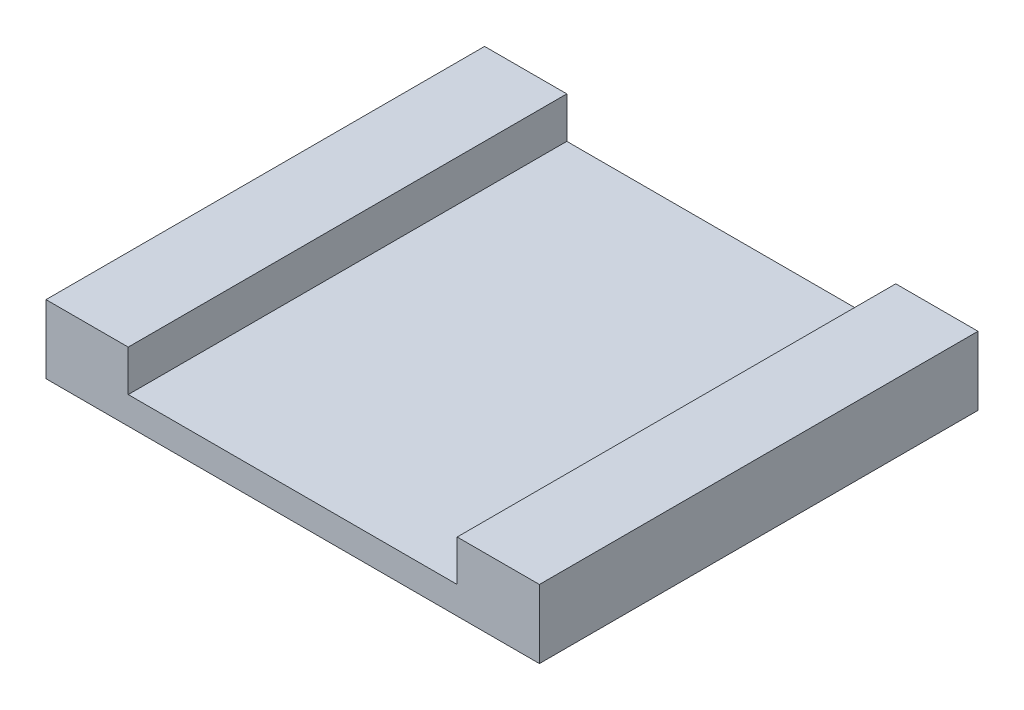
ISO-10303-21;
HEADER;
FILE_DESCRIPTION(('STEP AP214'),'2;1');
FILE_NAME('part.step','',(''),(''),'','','');
FILE_SCHEMA(('AUTOMOTIVE_DESIGN { 1 0 10303 214 1 1 1 1 }'));
ENDSEC;
DATA;
#1=APPLICATION_CONTEXT('core data for automotive mechanical design processes');
#2=APPLICATION_PROTOCOL_DEFINITION('international standard','automotive_design',2000,#1);
#3=PRODUCT_CONTEXT('',#1,'mechanical');
#4=PRODUCT('Part','Part','',(#3));
#5=PRODUCT_RELATED_PRODUCT_CATEGORY('part','',(#4));
#6=PRODUCT_DEFINITION_FORMATION('','',#4);
#7=PRODUCT_DEFINITION_CONTEXT('part definition',#1,'design');
#8=PRODUCT_DEFINITION('design','',#6,#7);
#9=PRODUCT_DEFINITION_SHAPE('','',#8);
#10=(LENGTH_UNIT() NAMED_UNIT(*) SI_UNIT(.MILLI.,.METRE.));
#11=(NAMED_UNIT(*) PLANE_ANGLE_UNIT() SI_UNIT($,.RADIAN.));
#12=(NAMED_UNIT(*) SI_UNIT($,.STERADIAN.) SOLID_ANGLE_UNIT());
#13=UNCERTAINTY_MEASURE_WITH_UNIT(LENGTH_MEASURE(1.E-05),#10,'distance_accuracy_value','');
#14=(GEOMETRIC_REPRESENTATION_CONTEXT(3) GLOBAL_UNCERTAINTY_ASSIGNED_CONTEXT((#13)) GLOBAL_UNIT_ASSIGNED_CONTEXT((#10,
#11,#12)) REPRESENTATION_CONTEXT('',''));
#15=CARTESIAN_POINT('',(0.,0.,0.));
#16=DIRECTION('',(0.,0.,1.));
#17=DIRECTION('',(1.,0.,0.));
#18=AXIS2_PLACEMENT_3D('',#15,#16,#17);
#19=CARTESIAN_POINT('',(0.,0.,-203.2));
#20=DIRECTION('',(0.,1.,0.));
#21=DIRECTION('',(0.,0.,1.));
#22=AXIS2_PLACEMENT_3D('',#19,#20,#21);
#23=PLANE('',#22);
#24=DIRECTION('',(-1.,0.,0.));
#25=VECTOR('',#24,1.);
#26=CARTESIAN_POINT('',(0.,0.,0.));
#27=LINE('',#26,#25);
#28=CARTESIAN_POINT('',(76.2,0.,0.));
#29=VERTEX_POINT('',#28);
#30=CARTESIAN_POINT('',(-76.2,0.,0.));
#31=VERTEX_POINT('',#30);
#32=EDGE_CURVE('E137',#29,#31,#27,.T.);
#33=ORIENTED_EDGE('',*,*,#32,.F.);
#34=DIRECTION('',(0.,0.,1.));
#35=VECTOR('',#34,1.);
#36=CARTESIAN_POINT('',(76.2,0.,-203.2));
#37=LINE('',#36,#35);
#38=CARTESIAN_POINT('',(76.2,0.,-203.2));
#39=VERTEX_POINT('',#38);
#40=EDGE_CURVE('E11',#39,#29,#37,.T.);
#41=ORIENTED_EDGE('',*,*,#40,.F.);
#42=DIRECTION('',(-1.,0.,0.));
#43=VECTOR('',#42,1.);
#44=CARTESIAN_POINT('',(0.,0.,-203.2));
#45=LINE('',#44,#43);
#46=CARTESIAN_POINT('',(-76.2,0.,-203.2));
#47=VERTEX_POINT('',#46);
#48=EDGE_CURVE('E103',#39,#47,#45,.T.);
#49=ORIENTED_EDGE('',*,*,#48,.T.);
#50=DIRECTION('',(0.,0.,1.));
#51=VECTOR('',#50,1.);
#52=CARTESIAN_POINT('',(-76.2,0.,-203.2));
#53=LINE('',#52,#51);
#54=EDGE_CURVE('E106',#47,#31,#53,.T.);
#55=ORIENTED_EDGE('',*,*,#54,.T.);
#56=EDGE_LOOP('',(#33,#41,#49,#55));
#57=FACE_BOUND('',#56,.T.);
#58=ADVANCED_FACE('F33',(#57),#23,.T.);
#59=CARTESIAN_POINT('',(76.2,0.,-203.2));
#60=DIRECTION('',(-1.,0.,0.));
#61=DIRECTION('',(0.,0.,1.));
#62=AXIS2_PLACEMENT_3D('',#59,#60,#61);
#63=PLANE('',#62);
#64=DIRECTION('',(0.,-1.,0.));
#65=VECTOR('',#64,1.);
#66=CARTESIAN_POINT('',(76.2,0.,0.));
#67=LINE('',#66,#65);
#68=CARTESIAN_POINT('',(76.2,19.05,0.));
#69=VERTEX_POINT('',#68);
#70=EDGE_CURVE('E152',#69,#29,#67,.T.);
#71=ORIENTED_EDGE('',*,*,#70,.F.);
#72=DIRECTION('',(0.,0.,1.));
#73=VECTOR('',#72,1.);
#74=CARTESIAN_POINT('',(76.2,19.05,-203.2));
#75=LINE('',#74,#73);
#76=CARTESIAN_POINT('',(76.2,19.05,-203.2));
#77=VERTEX_POINT('',#76);
#78=EDGE_CURVE('E43',#77,#69,#75,.T.);
#79=ORIENTED_EDGE('',*,*,#78,.F.);
#80=DIRECTION('',(0.,-1.,0.));
#81=VECTOR('',#80,1.);
#82=CARTESIAN_POINT('',(76.2,0.,-203.2));
#83=LINE('',#82,#81);
#84=EDGE_CURVE('E109',#77,#39,#83,.T.);
#85=ORIENTED_EDGE('',*,*,#84,.T.);
#86=ORIENTED_EDGE('',*,*,#40,.T.);
#87=EDGE_LOOP('',(#71,#79,#85,#86));
#88=FACE_BOUND('',#87,.T.);
#89=ADVANCED_FACE('F178',(#88),#63,.T.);
#90=CARTESIAN_POINT('',(76.2,19.05,-203.2));
#91=DIRECTION('',(0.,1.,0.));
#92=DIRECTION('',(0.,0.,1.));
#93=AXIS2_PLACEMENT_3D('',#90,#91,#92);
#94=PLANE('',#93);
#95=DIRECTION('',(-1.,0.,0.));
#96=VECTOR('',#95,1.);
#97=CARTESIAN_POINT('',(76.2,19.05,0.));
#98=LINE('',#97,#96);
#99=CARTESIAN_POINT('',(114.3,19.05,0.));
#100=VERTEX_POINT('',#99);
#101=EDGE_CURVE('E149',#100,#69,#98,.T.);
#102=ORIENTED_EDGE('',*,*,#101,.F.);
#103=DIRECTION('',(0.,0.,1.));
#104=VECTOR('',#103,1.);
#105=CARTESIAN_POINT('',(114.3,19.05,-203.2));
#106=LINE('',#105,#104);
#107=CARTESIAN_POINT('',(114.3,19.05,-203.2));
#108=VERTEX_POINT('',#107);
#109=EDGE_CURVE('E155',#108,#100,#106,.T.);
#110=ORIENTED_EDGE('',*,*,#109,.F.);
#111=DIRECTION('',(-1.,0.,0.));
#112=VECTOR('',#111,1.);
#113=CARTESIAN_POINT('',(76.2,19.05,-203.2));
#114=LINE('',#113,#112);
#115=EDGE_CURVE('E139',#108,#77,#114,.T.);
#116=ORIENTED_EDGE('',*,*,#115,.T.);
#117=ORIENTED_EDGE('',*,*,#78,.T.);
#118=EDGE_LOOP('',(#102,#110,#116,#117));
#119=FACE_BOUND('',#118,.T.);
#120=ADVANCED_FACE('F177',(#119),#94,.T.);
#121=CARTESIAN_POINT('',(114.3,19.05,-203.2));
#122=DIRECTION('',(1.,0.,0.));
#123=DIRECTION('',(0.,0.,-1.));
#124=AXIS2_PLACEMENT_3D('',#121,#122,#123);
#125=PLANE('',#124);
#126=DIRECTION('',(0.,1.,0.));
#127=VECTOR('',#126,1.);
#128=CARTESIAN_POINT('',(114.3,19.05,0.));
#129=LINE('',#128,#127);
#130=CARTESIAN_POINT('',(114.3,-12.7,0.));
#131=VERTEX_POINT('',#130);
#132=EDGE_CURVE('E145',#131,#100,#129,.T.);
#133=ORIENTED_EDGE('',*,*,#132,.F.);
#134=DIRECTION('',(0.,0.,1.));
#135=VECTOR('',#134,1.);
#136=CARTESIAN_POINT('',(114.3,-12.7,-203.2));
#137=LINE('',#136,#135);
#138=CARTESIAN_POINT('',(114.3,-12.7,-203.2));
#139=VERTEX_POINT('',#138);
#140=EDGE_CURVE('E37',#139,#131,#137,.T.);
#141=ORIENTED_EDGE('',*,*,#140,.F.);
#142=DIRECTION('',(0.,1.,0.));
#143=VECTOR('',#142,1.);
#144=CARTESIAN_POINT('',(114.3,19.05,-203.2));
#145=LINE('',#144,#143);
#146=EDGE_CURVE('E136',#139,#108,#145,.T.);
#147=ORIENTED_EDGE('',*,*,#146,.T.);
#148=ORIENTED_EDGE('',*,*,#109,.T.);
#149=EDGE_LOOP('',(#133,#141,#147,#148));
#150=FACE_BOUND('',#149,.T.);
#151=ADVANCED_FACE('F159',(#150),#125,.T.);
#152=CARTESIAN_POINT('',(114.3,-12.7,-203.2));
#153=DIRECTION('',(0.,-1.,0.));
#154=DIRECTION('',(1.,0.,0.));
#155=AXIS2_PLACEMENT_3D('',#152,#153,#154);
#156=PLANE('',#155);
#157=DIRECTION('',(1.,0.,0.));
#158=VECTOR('',#157,1.);
#159=CARTESIAN_POINT('',(114.3,-12.7,0.));
#160=LINE('',#159,#158);
#161=CARTESIAN_POINT('',(-114.3,-12.7,0.));
#162=VERTEX_POINT('',#161);
#163=EDGE_CURVE('E142',#162,#131,#160,.T.);
#164=ORIENTED_EDGE('',*,*,#163,.F.);
#165=DIRECTION('',(0.,0.,1.));
#166=VECTOR('',#165,1.);
#167=CARTESIAN_POINT('',(-114.3,-12.7,-203.2));
#168=LINE('',#167,#166);
#169=CARTESIAN_POINT('',(-114.3,-12.7,-203.2));
#170=VERTEX_POINT('',#169);
#171=EDGE_CURVE('E146',#170,#162,#168,.T.);
#172=ORIENTED_EDGE('',*,*,#171,.F.);
#173=DIRECTION('',(1.,0.,0.));
#174=VECTOR('',#173,1.);
#175=CARTESIAN_POINT('',(114.3,-12.7,-203.2));
#176=LINE('',#175,#174);
#177=EDGE_CURVE('E133',#170,#139,#176,.T.);
#178=ORIENTED_EDGE('',*,*,#177,.T.);
#179=ORIENTED_EDGE('',*,*,#140,.T.);
#180=EDGE_LOOP('',(#164,#172,#178,#179));
#181=FACE_BOUND('',#180,.T.);
#182=ADVANCED_FACE('F35',(#181),#156,.T.);
#183=CARTESIAN_POINT('',(0.,0.,-203.2));
#184=DIRECTION('',(0.,0.,-1.));
#185=DIRECTION('',(-1.,0.,0.));
#186=AXIS2_PLACEMENT_3D('',#183,#184,#185);
#187=PLANE('',#186);
#188=ORIENTED_EDGE('',*,*,#177,.F.);
#189=DIRECTION('',(0.,1.,0.));
#190=VECTOR('',#189,1.);
#191=CARTESIAN_POINT('',(-114.3,19.05,-203.2));
#192=LINE('',#191,#190);
#193=CARTESIAN_POINT('',(-114.3,19.05,-203.2));
#194=VERTEX_POINT('',#193);
#195=EDGE_CURVE('E126',#170,#194,#192,.T.);
#196=ORIENTED_EDGE('',*,*,#195,.T.);
#197=DIRECTION('',(1.,0.,0.));
#198=VECTOR('',#197,1.);
#199=CARTESIAN_POINT('',(-76.2,19.05,-203.2));
#200=LINE('',#199,#198);
#201=CARTESIAN_POINT('',(-76.2,19.05,-203.2));
#202=VERTEX_POINT('',#201);
#203=EDGE_CURVE('E115',#194,#202,#200,.T.);
#204=ORIENTED_EDGE('',*,*,#203,.T.);
#205=DIRECTION('',(0.,-1.,0.));
#206=VECTOR('',#205,1.);
#207=CARTESIAN_POINT('',(-76.2,0.,-203.2));
#208=LINE('',#207,#206);
#209=EDGE_CURVE('E112',#202,#47,#208,.T.);
#210=ORIENTED_EDGE('',*,*,#209,.T.);
#211=ORIENTED_EDGE('',*,*,#48,.F.);
#212=ORIENTED_EDGE('',*,*,#84,.F.);
#213=ORIENTED_EDGE('',*,*,#115,.F.);
#214=ORIENTED_EDGE('',*,*,#146,.F.);
#215=EDGE_LOOP('',(#188,#196,#204,#210,#211,#212,#213,#214));
#216=FACE_BOUND('',#215,.T.);
#217=ADVANCED_FACE('F113',(#216),#187,.T.);
#218=CARTESIAN_POINT('',(0.,0.,0.));
#219=DIRECTION('',(0.,0.,-1.));
#220=DIRECTION('',(-1.,0.,0.));
#221=AXIS2_PLACEMENT_3D('',#218,#219,#220);
#222=PLANE('',#221);
#223=ORIENTED_EDGE('',*,*,#32,.T.);
#224=DIRECTION('',(0.,-1.,0.));
#225=VECTOR('',#224,1.);
#226=CARTESIAN_POINT('',(-76.2,0.,0.));
#227=LINE('',#226,#225);
#228=CARTESIAN_POINT('',(-76.2,19.05,0.));
#229=VERTEX_POINT('',#228);
#230=EDGE_CURVE('E124',#229,#31,#227,.T.);
#231=ORIENTED_EDGE('',*,*,#230,.F.);
#232=DIRECTION('',(1.,0.,0.));
#233=VECTOR('',#232,1.);
#234=CARTESIAN_POINT('',(-76.2,19.05,0.));
#235=LINE('',#234,#233);
#236=CARTESIAN_POINT('',(-114.3,19.05,0.));
#237=VERTEX_POINT('',#236);
#238=EDGE_CURVE('E164',#237,#229,#235,.T.);
#239=ORIENTED_EDGE('',*,*,#238,.F.);
#240=DIRECTION('',(0.,1.,0.));
#241=VECTOR('',#240,1.);
#242=CARTESIAN_POINT('',(-114.3,19.05,0.));
#243=LINE('',#242,#241);
#244=EDGE_CURVE('E119',#162,#237,#243,.T.);
#245=ORIENTED_EDGE('',*,*,#244,.F.);
#246=ORIENTED_EDGE('',*,*,#163,.T.);
#247=ORIENTED_EDGE('',*,*,#132,.T.);
#248=ORIENTED_EDGE('',*,*,#101,.T.);
#249=ORIENTED_EDGE('',*,*,#70,.T.);
#250=EDGE_LOOP('',(#223,#231,#239,#245,#246,#247,#248,#249));
#251=FACE_BOUND('',#250,.T.);
#252=ADVANCED_FACE('F162',(#251),#222,.F.);
#253=CARTESIAN_POINT('',(-114.3,19.05,-203.2));
#254=DIRECTION('',(1.,0.,0.));
#255=DIRECTION('',(0.,0.,-1.));
#256=AXIS2_PLACEMENT_3D('',#253,#254,#255);
#257=PLANE('',#256);
#258=ORIENTED_EDGE('',*,*,#244,.T.);
#259=DIRECTION('',(0.,0.,1.));
#260=VECTOR('',#259,1.);
#261=CARTESIAN_POINT('',(-114.3,19.05,-203.2));
#262=LINE('',#261,#260);
#263=EDGE_CURVE('E128',#194,#237,#262,.T.);
#264=ORIENTED_EDGE('',*,*,#263,.F.);
#265=ORIENTED_EDGE('',*,*,#195,.F.);
#266=ORIENTED_EDGE('',*,*,#171,.T.);
#267=EDGE_LOOP('',(#258,#264,#265,#266));
#268=FACE_BOUND('',#267,.T.);
#269=ADVANCED_FACE('F175',(#268),#257,.F.);
#270=CARTESIAN_POINT('',(-76.2,19.05,-203.2));
#271=DIRECTION('',(0.,-1.,0.));
#272=DIRECTION('',(0.,0.,-1.));
#273=AXIS2_PLACEMENT_3D('',#270,#271,#272);
#274=PLANE('',#273);
#275=ORIENTED_EDGE('',*,*,#238,.T.);
#276=DIRECTION('',(0.,0.,1.));
#277=VECTOR('',#276,1.);
#278=CARTESIAN_POINT('',(-76.2,19.05,-203.2));
#279=LINE('',#278,#277);
#280=EDGE_CURVE('E125',#202,#229,#279,.T.);
#281=ORIENTED_EDGE('',*,*,#280,.F.);
#282=ORIENTED_EDGE('',*,*,#203,.F.);
#283=ORIENTED_EDGE('',*,*,#263,.T.);
#284=EDGE_LOOP('',(#275,#281,#282,#283));
#285=FACE_BOUND('',#284,.T.);
#286=ADVANCED_FACE('F173',(#285),#274,.F.);
#287=CARTESIAN_POINT('',(-76.2,0.,-203.2));
#288=DIRECTION('',(-1.,0.,0.));
#289=DIRECTION('',(0.,0.,1.));
#290=AXIS2_PLACEMENT_3D('',#287,#288,#289);
#291=PLANE('',#290);
#292=ORIENTED_EDGE('',*,*,#230,.T.);
#293=ORIENTED_EDGE('',*,*,#54,.F.);
#294=ORIENTED_EDGE('',*,*,#209,.F.);
#295=ORIENTED_EDGE('',*,*,#280,.T.);
#296=EDGE_LOOP('',(#292,#293,#294,#295));
#297=FACE_BOUND('',#296,.T.);
#298=ADVANCED_FACE('F122',(#297),#291,.F.);
#299=CLOSED_SHELL('',(#58,#89,#120,#151,#182,#217,#252,#269,#286,#298));
#300=MANIFOLD_SOLID_BREP('B2',#299);
#301=ADVANCED_BREP_SHAPE_REPRESENTATION('',(#18,#300),#14);
#302=SHAPE_DEFINITION_REPRESENTATION(#9,#301);
ENDSEC;
END-ISO-10303-21;
